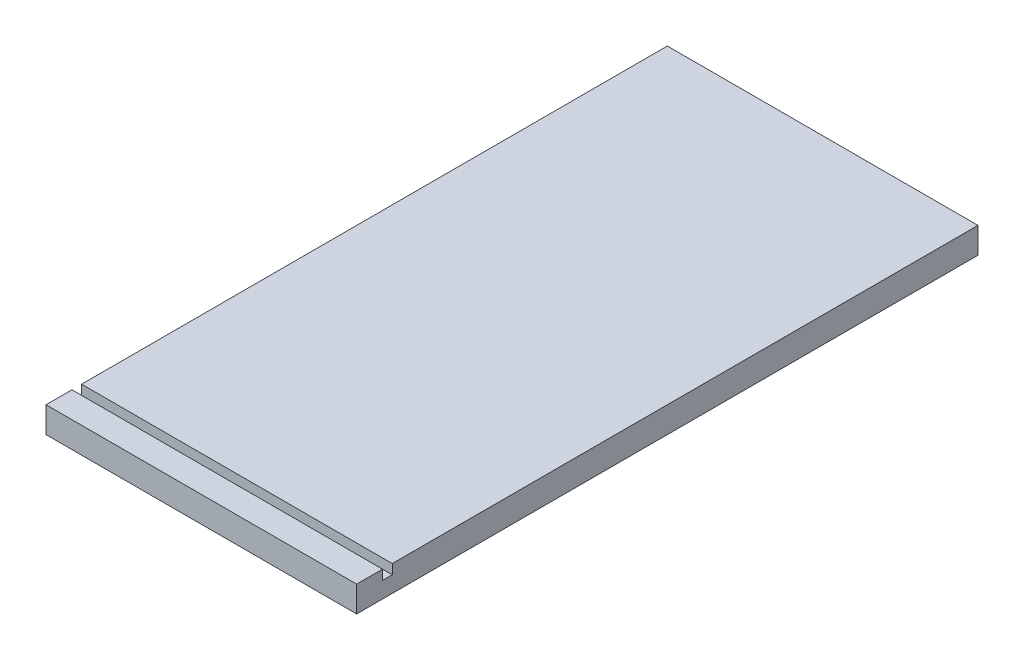
ISO-10303-21;
HEADER;
FILE_DESCRIPTION(('STEP AP214'),'2;1');
FILE_NAME('part.step','',(''),(''),'','','');
FILE_SCHEMA(('AUTOMOTIVE_DESIGN { 1 0 10303 214 1 1 1 1 }'));
ENDSEC;
DATA;
#1=APPLICATION_CONTEXT('core data for automotive mechanical design processes');
#2=APPLICATION_PROTOCOL_DEFINITION('international standard','automotive_design',2000,#1);
#3=PRODUCT_CONTEXT('',#1,'mechanical');
#4=PRODUCT('Part','Part','',(#3));
#5=PRODUCT_RELATED_PRODUCT_CATEGORY('part','',(#4));
#6=PRODUCT_DEFINITION_FORMATION('','',#4);
#7=PRODUCT_DEFINITION_CONTEXT('part definition',#1,'design');
#8=PRODUCT_DEFINITION('design','',#6,#7);
#9=PRODUCT_DEFINITION_SHAPE('','',#8);
#10=(LENGTH_UNIT() NAMED_UNIT(*) SI_UNIT(.MILLI.,.METRE.));
#11=(NAMED_UNIT(*) PLANE_ANGLE_UNIT() SI_UNIT($,.RADIAN.));
#12=(NAMED_UNIT(*) SI_UNIT($,.STERADIAN.) SOLID_ANGLE_UNIT());
#13=UNCERTAINTY_MEASURE_WITH_UNIT(LENGTH_MEASURE(1.E-05),#10,'distance_accuracy_value','');
#14=(GEOMETRIC_REPRESENTATION_CONTEXT(3) GLOBAL_UNCERTAINTY_ASSIGNED_CONTEXT((#13)) GLOBAL_UNIT_ASSIGNED_CONTEXT((#10,
#11,#12)) REPRESENTATION_CONTEXT('',''));
#15=CARTESIAN_POINT('',(0.,0.,0.));
#16=DIRECTION('',(0.,0.,1.));
#17=DIRECTION('',(1.,0.,0.));
#18=AXIS2_PLACEMENT_3D('',#15,#16,#17);
#19=CARTESIAN_POINT('',(-152.4,12.7,304.8));
#20=DIRECTION('',(-1.,0.,0.));
#21=DIRECTION('',(0.,0.,1.));
#22=AXIS2_PLACEMENT_3D('',#19,#20,#21);
#23=PLANE('',#22);
#24=DIRECTION('',(0.,0.,-1.));
#25=VECTOR('',#24,1.);
#26=CARTESIAN_POINT('',(-152.4,12.7,304.8));
#27=LINE('',#26,#25);
#28=CARTESIAN_POINT('',(-152.4,12.7,304.8));
#29=VERTEX_POINT('',#28);
#30=CARTESIAN_POINT('',(-152.4,12.7,279.4));
#31=VERTEX_POINT('',#30);
#32=EDGE_CURVE('E156',#29,#31,#27,.T.);
#33=ORIENTED_EDGE('',*,*,#32,.T.);
#34=DIRECTION('',(0.,-1.,0.));
#35=VECTOR('',#34,1.);
#36=CARTESIAN_POINT('',(-152.4,12.7,279.4));
#37=LINE('',#36,#35);
#38=CARTESIAN_POINT('',(-152.4,3.17500000000001,279.4));
#39=VERTEX_POINT('',#38);
#40=EDGE_CURVE('E134',#31,#39,#37,.T.);
#41=ORIENTED_EDGE('',*,*,#40,.T.);
#42=DIRECTION('',(0.,0.,-1.));
#43=VECTOR('',#42,1.);
#44=CARTESIAN_POINT('',(-152.4,3.17500000000001,279.4));
#45=LINE('',#44,#43);
#46=CARTESIAN_POINT('',(-152.4,3.175,269.875));
#47=VERTEX_POINT('',#46);
#48=EDGE_CURVE('E138',#39,#47,#45,.T.);
#49=ORIENTED_EDGE('',*,*,#48,.T.);
#50=DIRECTION('',(0.,-1.,0.));
#51=VECTOR('',#50,1.);
#52=CARTESIAN_POINT('',(-152.4,12.7,269.875));
#53=LINE('',#52,#51);
#54=CARTESIAN_POINT('',(-152.4,12.7,269.875));
#55=VERTEX_POINT('',#54);
#56=EDGE_CURVE('E124',#55,#47,#53,.T.);
#57=ORIENTED_EDGE('',*,*,#56,.F.);
#58=CARTESIAN_POINT('',(-152.4,12.7,-304.8));
#59=VERTEX_POINT('',#58);
#60=EDGE_CURVE('E87',#55,#59,#27,.T.);
#61=ORIENTED_EDGE('',*,*,#60,.T.);
#62=DIRECTION('',(0.,-1.,0.));
#63=VECTOR('',#62,1.);
#64=CARTESIAN_POINT('',(-152.4,12.7,-304.8));
#65=LINE('',#64,#63);
#66=CARTESIAN_POINT('',(-152.4,-12.7,-304.8));
#67=VERTEX_POINT('',#66);
#68=EDGE_CURVE('E42',#59,#67,#65,.T.);
#69=ORIENTED_EDGE('',*,*,#68,.T.);
#70=DIRECTION('',(0.,0.,-1.));
#71=VECTOR('',#70,1.);
#72=CARTESIAN_POINT('',(-152.4,-12.7,304.8));
#73=LINE('',#72,#71);
#74=CARTESIAN_POINT('',(-152.4,-12.7,304.8));
#75=VERTEX_POINT('',#74);
#76=EDGE_CURVE('E151',#75,#67,#73,.T.);
#77=ORIENTED_EDGE('',*,*,#76,.F.);
#78=DIRECTION('',(0.,-1.,0.));
#79=VECTOR('',#78,1.);
#80=CARTESIAN_POINT('',(-152.4,12.7,304.8));
#81=LINE('',#80,#79);
#82=EDGE_CURVE('E11',#29,#75,#81,.T.);
#83=ORIENTED_EDGE('',*,*,#82,.F.);
#84=EDGE_LOOP('',(#33,#41,#49,#57,#61,#69,#77,#83));
#85=FACE_BOUND('',#84,.T.);
#86=ADVANCED_FACE('F39',(#85),#23,.T.);
#87=CARTESIAN_POINT('',(152.4,12.7,304.8));
#88=DIRECTION('',(-1.,0.,0.));
#89=DIRECTION('',(0.,0.,1.));
#90=AXIS2_PLACEMENT_3D('',#87,#88,#89);
#91=PLANE('',#90);
#92=DIRECTION('',(0.,-1.,0.));
#93=VECTOR('',#92,1.);
#94=CARTESIAN_POINT('',(152.4,12.7,279.4));
#95=LINE('',#94,#93);
#96=CARTESIAN_POINT('',(152.4,12.7,279.4));
#97=VERTEX_POINT('',#96);
#98=CARTESIAN_POINT('',(152.4,3.17500000000001,279.4));
#99=VERTEX_POINT('',#98);
#100=EDGE_CURVE('E121',#97,#99,#95,.T.);
#101=ORIENTED_EDGE('',*,*,#100,.F.);
#102=DIRECTION('',(0.,0.,-1.));
#103=VECTOR('',#102,1.);
#104=CARTESIAN_POINT('',(152.4,12.7,304.8));
#105=LINE('',#104,#103);
#106=CARTESIAN_POINT('',(152.4,12.7,304.8));
#107=VERTEX_POINT('',#106);
#108=EDGE_CURVE('E163',#107,#97,#105,.T.);
#109=ORIENTED_EDGE('',*,*,#108,.F.);
#110=DIRECTION('',(0.,-1.,0.));
#111=VECTOR('',#110,1.);
#112=CARTESIAN_POINT('',(152.4,12.7,304.8));
#113=LINE('',#112,#111);
#114=CARTESIAN_POINT('',(152.4,-12.7,304.8));
#115=VERTEX_POINT('',#114);
#116=EDGE_CURVE('E48',#107,#115,#113,.T.);
#117=ORIENTED_EDGE('',*,*,#116,.T.);
#118=DIRECTION('',(0.,0.,-1.));
#119=VECTOR('',#118,1.);
#120=CARTESIAN_POINT('',(152.4,-12.7,304.8));
#121=LINE('',#120,#119);
#122=CARTESIAN_POINT('',(152.4,-12.7,-304.8));
#123=VERTEX_POINT('',#122);
#124=EDGE_CURVE('E177',#115,#123,#121,.T.);
#125=ORIENTED_EDGE('',*,*,#124,.T.);
#126=DIRECTION('',(0.,-1.,0.));
#127=VECTOR('',#126,1.);
#128=CARTESIAN_POINT('',(152.4,12.7,-304.8));
#129=LINE('',#128,#127);
#130=CARTESIAN_POINT('',(152.4,12.7,-304.8));
#131=VERTEX_POINT('',#130);
#132=EDGE_CURVE('E186',#131,#123,#129,.T.);
#133=ORIENTED_EDGE('',*,*,#132,.F.);
#134=CARTESIAN_POINT('',(152.4,12.7,269.875));
#135=VERTEX_POINT('',#134);
#136=EDGE_CURVE('E132',#135,#131,#105,.T.);
#137=ORIENTED_EDGE('',*,*,#136,.F.);
#138=DIRECTION('',(0.,-1.,0.));
#139=VECTOR('',#138,1.);
#140=CARTESIAN_POINT('',(152.4,12.7,269.875));
#141=LINE('',#140,#139);
#142=CARTESIAN_POINT('',(152.4,3.175,269.875));
#143=VERTEX_POINT('',#142);
#144=EDGE_CURVE('E56',#135,#143,#141,.T.);
#145=ORIENTED_EDGE('',*,*,#144,.T.);
#146=DIRECTION('',(0.,0.,-1.));
#147=VECTOR('',#146,1.);
#148=CARTESIAN_POINT('',(152.4,3.17500000000001,279.4));
#149=LINE('',#148,#147);
#150=EDGE_CURVE('E112',#99,#143,#149,.T.);
#151=ORIENTED_EDGE('',*,*,#150,.F.);
#152=EDGE_LOOP('',(#101,#109,#117,#125,#133,#137,#145,#151));
#153=FACE_BOUND('',#152,.T.);
#154=ADVANCED_FACE('F130',(#153),#91,.F.);
#155=CARTESIAN_POINT('',(0.,12.7,0.));
#156=DIRECTION('',(0.,-1.,0.));
#157=DIRECTION('',(0.,0.,-1.));
#158=AXIS2_PLACEMENT_3D('',#155,#156,#157);
#159=PLANE('',#158);
#160=DIRECTION('',(-1.,0.,0.));
#161=VECTOR('',#160,1.);
#162=CARTESIAN_POINT('',(152.4,12.7,279.4));
#163=LINE('',#162,#161);
#164=EDGE_CURVE('E147',#97,#31,#163,.T.);
#165=ORIENTED_EDGE('',*,*,#164,.T.);
#166=ORIENTED_EDGE('',*,*,#32,.F.);
#167=DIRECTION('',(1.,0.,0.));
#168=VECTOR('',#167,1.);
#169=CARTESIAN_POINT('',(-152.4,12.7,304.8));
#170=LINE('',#169,#168);
#171=EDGE_CURVE('E167',#29,#107,#170,.T.);
#172=ORIENTED_EDGE('',*,*,#171,.T.);
#173=ORIENTED_EDGE('',*,*,#108,.T.);
#174=EDGE_LOOP('',(#165,#166,#172,#173));
#175=FACE_BOUND('',#174,.T.);
#176=ADVANCED_FACE('F200',(#175),#159,.F.);
#177=CARTESIAN_POINT('',(-152.4,12.7,304.8));
#178=DIRECTION('',(0.,0.,-1.));
#179=DIRECTION('',(-1.,0.,0.));
#180=AXIS2_PLACEMENT_3D('',#177,#178,#179);
#181=PLANE('',#180);
#182=DIRECTION('',(1.,0.,0.));
#183=VECTOR('',#182,1.);
#184=CARTESIAN_POINT('',(-152.4,-12.7,304.8));
#185=LINE('',#184,#183);
#186=EDGE_CURVE('E181',#75,#115,#185,.T.);
#187=ORIENTED_EDGE('',*,*,#186,.T.);
#188=ORIENTED_EDGE('',*,*,#116,.F.);
#189=ORIENTED_EDGE('',*,*,#171,.F.);
#190=ORIENTED_EDGE('',*,*,#82,.T.);
#191=EDGE_LOOP('',(#187,#188,#189,#190));
#192=FACE_BOUND('',#191,.T.);
#193=ADVANCED_FACE('F197',(#192),#181,.F.);
#194=CARTESIAN_POINT('',(-152.4,12.7,-304.8));
#195=DIRECTION('',(0.,0.,-1.));
#196=DIRECTION('',(-1.,0.,0.));
#197=AXIS2_PLACEMENT_3D('',#194,#195,#196);
#198=PLANE('',#197);
#199=DIRECTION('',(1.,0.,0.));
#200=VECTOR('',#199,1.);
#201=CARTESIAN_POINT('',(-152.4,-12.7,-304.8));
#202=LINE('',#201,#200);
#203=EDGE_CURVE('E173',#67,#123,#202,.T.);
#204=ORIENTED_EDGE('',*,*,#203,.F.);
#205=ORIENTED_EDGE('',*,*,#68,.F.);
#206=DIRECTION('',(1.,0.,0.));
#207=VECTOR('',#206,1.);
#208=CARTESIAN_POINT('',(-152.4,12.7,-304.8));
#209=LINE('',#208,#207);
#210=EDGE_CURVE('E159',#59,#131,#209,.T.);
#211=ORIENTED_EDGE('',*,*,#210,.T.);
#212=ORIENTED_EDGE('',*,*,#132,.T.);
#213=EDGE_LOOP('',(#204,#205,#211,#212));
#214=FACE_BOUND('',#213,.T.);
#215=ADVANCED_FACE('F192',(#214),#198,.T.);
#216=ORIENTED_EDGE('',*,*,#60,.F.);
#217=DIRECTION('',(-1.,0.,0.));
#218=VECTOR('',#217,1.);
#219=CARTESIAN_POINT('',(152.4,12.7,269.875));
#220=LINE('',#219,#218);
#221=EDGE_CURVE('E127',#135,#55,#220,.T.);
#222=ORIENTED_EDGE('',*,*,#221,.F.);
#223=ORIENTED_EDGE('',*,*,#136,.T.);
#224=ORIENTED_EDGE('',*,*,#210,.F.);
#225=EDGE_LOOP('',(#216,#222,#223,#224));
#226=FACE_BOUND('',#225,.T.);
#227=ADVANCED_FACE('F211',(#226),#159,.F.);
#228=CARTESIAN_POINT('',(0.,-12.7,0.));
#229=DIRECTION('',(0.,-1.,0.));
#230=DIRECTION('',(0.,0.,-1.));
#231=AXIS2_PLACEMENT_3D('',#228,#229,#230);
#232=PLANE('',#231);
#233=ORIENTED_EDGE('',*,*,#76,.T.);
#234=ORIENTED_EDGE('',*,*,#203,.T.);
#235=ORIENTED_EDGE('',*,*,#124,.F.);
#236=ORIENTED_EDGE('',*,*,#186,.F.);
#237=EDGE_LOOP('',(#233,#234,#235,#236));
#238=FACE_BOUND('',#237,.T.);
#239=ADVANCED_FACE('F195',(#238),#232,.T.);
#240=CARTESIAN_POINT('',(152.4,12.7,279.4));
#241=DIRECTION('',(0.,0.,-1.));
#242=DIRECTION('',(-1.,0.,0.));
#243=AXIS2_PLACEMENT_3D('',#240,#241,#242);
#244=PLANE('',#243);
#245=ORIENTED_EDGE('',*,*,#40,.F.);
#246=ORIENTED_EDGE('',*,*,#164,.F.);
#247=ORIENTED_EDGE('',*,*,#100,.T.);
#248=DIRECTION('',(-1.,0.,0.));
#249=VECTOR('',#248,1.);
#250=CARTESIAN_POINT('',(152.4,3.17500000000001,279.4));
#251=LINE('',#250,#249);
#252=EDGE_CURVE('E117',#99,#39,#251,.T.);
#253=ORIENTED_EDGE('',*,*,#252,.T.);
#254=EDGE_LOOP('',(#245,#246,#247,#253));
#255=FACE_BOUND('',#254,.T.);
#256=ADVANCED_FACE('F203',(#255),#244,.T.);
#257=CARTESIAN_POINT('',(152.4,3.17500000000001,279.4));
#258=DIRECTION('',(0.,1.,0.));
#259=DIRECTION('',(0.,0.,1.));
#260=AXIS2_PLACEMENT_3D('',#257,#258,#259);
#261=PLANE('',#260);
#262=ORIENTED_EDGE('',*,*,#48,.F.);
#263=ORIENTED_EDGE('',*,*,#252,.F.);
#264=ORIENTED_EDGE('',*,*,#150,.T.);
#265=DIRECTION('',(-1.,0.,0.));
#266=VECTOR('',#265,1.);
#267=CARTESIAN_POINT('',(152.4,3.175,269.875));
#268=LINE('',#267,#266);
#269=EDGE_CURVE('E115',#143,#47,#268,.T.);
#270=ORIENTED_EDGE('',*,*,#269,.T.);
#271=EDGE_LOOP('',(#262,#263,#264,#270));
#272=FACE_BOUND('',#271,.T.);
#273=ADVANCED_FACE('F114',(#272),#261,.T.);
#274=CARTESIAN_POINT('',(152.4,12.7,269.875));
#275=DIRECTION('',(0.,0.,-1.));
#276=DIRECTION('',(-1.,0.,0.));
#277=AXIS2_PLACEMENT_3D('',#274,#275,#276);
#278=PLANE('',#277);
#279=ORIENTED_EDGE('',*,*,#56,.T.);
#280=ORIENTED_EDGE('',*,*,#269,.F.);
#281=ORIENTED_EDGE('',*,*,#144,.F.);
#282=ORIENTED_EDGE('',*,*,#221,.T.);
#283=EDGE_LOOP('',(#279,#280,#281,#282));
#284=FACE_BOUND('',#283,.T.);
#285=ADVANCED_FACE('F123',(#284),#278,.F.);
#286=CLOSED_SHELL('',(#86,#154,#176,#193,#215,#227,#239,#256,#273,#285));
#287=MANIFOLD_SOLID_BREP('B2',#286);
#288=ADVANCED_BREP_SHAPE_REPRESENTATION('',(#18,#287),#14);
#289=SHAPE_DEFINITION_REPRESENTATION(#9,#288);
ENDSEC;
END-ISO-10303-21;
